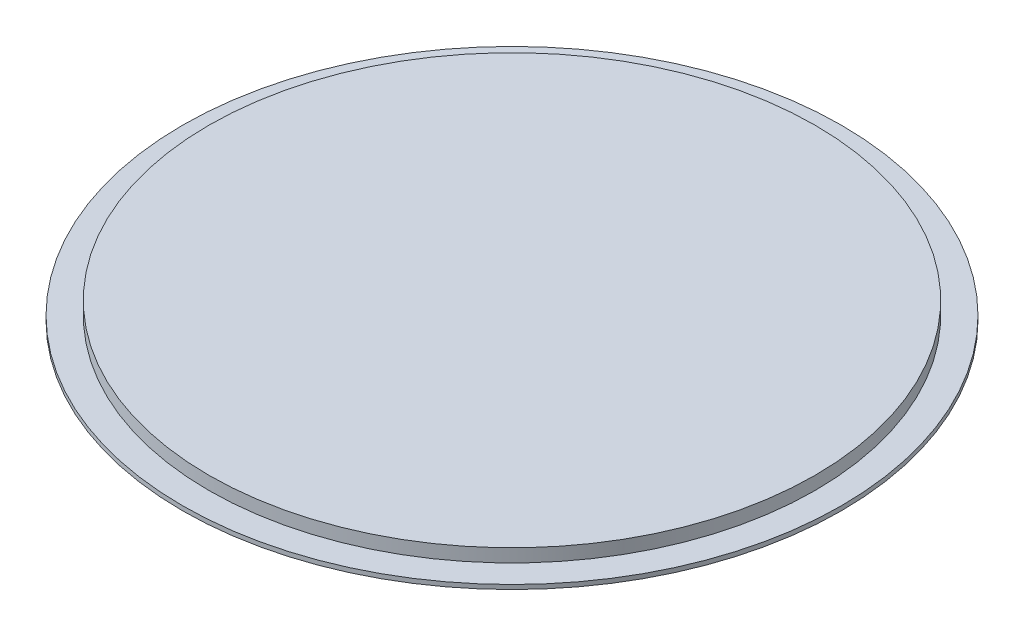
ISO-10303-21;
HEADER;
FILE_DESCRIPTION(('STEP AP214'),'2;1');
FILE_NAME('part.step','',(''),(''),'','','');
FILE_SCHEMA(('AUTOMOTIVE_DESIGN { 1 0 10303 214 1 1 1 1 }'));
ENDSEC;
DATA;
#1=APPLICATION_CONTEXT('core data for automotive mechanical design processes');
#2=APPLICATION_PROTOCOL_DEFINITION('international standard','automotive_design',2000,#1);
#3=PRODUCT_CONTEXT('',#1,'mechanical');
#4=PRODUCT('Part','Part','',(#3));
#5=PRODUCT_RELATED_PRODUCT_CATEGORY('part','',(#4));
#6=PRODUCT_DEFINITION_FORMATION('','',#4);
#7=PRODUCT_DEFINITION_CONTEXT('part definition',#1,'design');
#8=PRODUCT_DEFINITION('design','',#6,#7);
#9=PRODUCT_DEFINITION_SHAPE('','',#8);
#10=(LENGTH_UNIT() NAMED_UNIT(*) SI_UNIT(.MILLI.,.METRE.));
#11=(NAMED_UNIT(*) PLANE_ANGLE_UNIT() SI_UNIT($,.RADIAN.));
#12=(NAMED_UNIT(*) SI_UNIT($,.STERADIAN.) SOLID_ANGLE_UNIT());
#13=UNCERTAINTY_MEASURE_WITH_UNIT(LENGTH_MEASURE(1.E-05),#10,'distance_accuracy_value','');
#14=(GEOMETRIC_REPRESENTATION_CONTEXT(3) GLOBAL_UNCERTAINTY_ASSIGNED_CONTEXT((#13)) GLOBAL_UNIT_ASSIGNED_CONTEXT((#10,
#11,#12)) REPRESENTATION_CONTEXT('',''));
#15=CARTESIAN_POINT('',(0.,0.,0.));
#16=DIRECTION('',(0.,0.,1.));
#17=DIRECTION('',(1.,0.,0.));
#18=AXIS2_PLACEMENT_3D('',#15,#16,#17);
#19=CARTESIAN_POINT('',(0.,3.,0.));
#20=DIRECTION('',(0.,-1.,0.));
#21=DIRECTION('',(0.,0.,-1.));
#22=AXIS2_PLACEMENT_3D('',#19,#20,#21);
#23=CYLINDRICAL_SURFACE('',#22,34.5);
#24=CARTESIAN_POINT('',(0.,1.5,0.));
#25=DIRECTION('',(0.,1.,0.));
#26=DIRECTION('',(0.,0.,1.));
#27=AXIS2_PLACEMENT_3D('',#24,#25,#26);
#28=CIRCLE('',#27,34.5);
#29=CARTESIAN_POINT('',(0.,1.5,34.5));
#30=VERTEX_POINT('',#29);
#31=EDGE_CURVE('E41',#30,#30,#28,.T.);
#32=ORIENTED_EDGE('',*,*,#31,.T.);
#33=EDGE_LOOP('',(#32));
#34=FACE_BOUND('',#33,.T.);
#35=CARTESIAN_POINT('',(0.,3.,0.));
#36=DIRECTION('',(0.,1.,0.));
#37=DIRECTION('',(0.,0.,1.));
#38=AXIS2_PLACEMENT_3D('',#35,#36,#37);
#39=CIRCLE('',#38,34.5);
#40=CARTESIAN_POINT('',(0.,3.,34.5));
#41=VERTEX_POINT('',#40);
#42=EDGE_CURVE('E51',#41,#41,#39,.T.);
#43=ORIENTED_EDGE('',*,*,#42,.F.);
#44=EDGE_LOOP('',(#43));
#45=FACE_BOUND('',#44,.T.);
#46=ADVANCED_FACE('F37',(#34,#45),#23,.T.);
#47=CARTESIAN_POINT('',(0.,3.,0.));
#48=DIRECTION('',(0.,1.,0.));
#49=DIRECTION('',(0.,0.,1.));
#50=AXIS2_PLACEMENT_3D('',#47,#48,#49);
#51=PLANE('',#50);
#52=ORIENTED_EDGE('',*,*,#42,.T.);
#53=EDGE_LOOP('',(#52));
#54=FACE_BOUND('',#53,.T.);
#55=ADVANCED_FACE('F77',(#54),#51,.T.);
#56=CARTESIAN_POINT('',(0.,1.5,0.));
#57=DIRECTION('',(0.,-1.,0.));
#58=DIRECTION('',(0.,0.,-1.));
#59=AXIS2_PLACEMENT_3D('',#56,#57,#58);
#60=CYLINDRICAL_SURFACE('',#59,37.5);
#61=CARTESIAN_POINT('',(0.,1.5,0.));
#62=DIRECTION('',(0.,1.,0.));
#63=DIRECTION('',(0.,0.,1.));
#64=AXIS2_PLACEMENT_3D('',#61,#62,#63);
#65=CIRCLE('',#64,37.5);
#66=CARTESIAN_POINT('',(0.,1.5,37.5));
#67=VERTEX_POINT('',#66);
#68=EDGE_CURVE('E57',#67,#67,#65,.T.);
#69=ORIENTED_EDGE('',*,*,#68,.F.);
#70=EDGE_LOOP('',(#69));
#71=FACE_BOUND('',#70,.T.);
#72=CARTESIAN_POINT('',(0.,1.,0.));
#73=DIRECTION('',(0.,1.,0.));
#74=DIRECTION('',(0.,0.,1.));
#75=AXIS2_PLACEMENT_3D('',#72,#73,#74);
#76=CIRCLE('',#75,37.5);
#77=CARTESIAN_POINT('',(0.,1.,37.5));
#78=VERTEX_POINT('',#77);
#79=EDGE_CURVE('E46',#78,#78,#76,.T.);
#80=ORIENTED_EDGE('',*,*,#79,.T.);
#81=EDGE_LOOP('',(#80));
#82=FACE_BOUND('',#81,.T.);
#83=ADVANCED_FACE('F71',(#71,#82),#60,.T.);
#84=CARTESIAN_POINT('',(0.,1.5,0.));
#85=DIRECTION('',(0.,1.,0.));
#86=DIRECTION('',(0.,0.,1.));
#87=AXIS2_PLACEMENT_3D('',#84,#85,#86);
#88=PLANE('',#87);
#89=ORIENTED_EDGE('',*,*,#31,.F.);
#90=EDGE_LOOP('',(#89));
#91=FACE_BOUND('',#90,.T.);
#92=ORIENTED_EDGE('',*,*,#68,.T.);
#93=EDGE_LOOP('',(#92));
#94=FACE_BOUND('',#93,.T.);
#95=ADVANCED_FACE('F68',(#91,#94),#88,.T.);
#96=CARTESIAN_POINT('',(0.,0.,0.));
#97=DIRECTION('',(0.,1.,0.));
#98=DIRECTION('',(0.,0.,1.));
#99=AXIS2_PLACEMENT_3D('',#96,#97,#98);
#100=PLANE('',#99);
#101=CARTESIAN_POINT('',(0.,0.,0.));
#102=DIRECTION('',(0.,1.,0.));
#103=DIRECTION('',(0.,0.,1.));
#104=AXIS2_PLACEMENT_3D('',#101,#102,#103);
#105=CIRCLE('',#104,34.5);
#106=CARTESIAN_POINT('',(0.,0.,34.5));
#107=VERTEX_POINT('',#106);
#108=EDGE_CURVE('E10',#107,#107,#105,.F.);
#109=ORIENTED_EDGE('',*,*,#108,.T.);
#110=EDGE_LOOP('',(#109));
#111=FACE_BOUND('',#110,.T.);
#112=ADVANCED_FACE('F70',(#111),#100,.F.);
#113=CARTESIAN_POINT('',(0.,5.,0.));
#114=DIRECTION('',(0.,-1.,0.));
#115=DIRECTION('',(0.,0.,-1.));
#116=AXIS2_PLACEMENT_3D('',#113,#114,#115);
#117=TOROIDAL_SURFACE('',#116,34.5,5.);
#118=ORIENTED_EDGE('',*,*,#108,.F.);
#119=EDGE_LOOP('',(#118));
#120=FACE_BOUND('',#119,.T.);
#121=ORIENTED_EDGE('',*,*,#79,.F.);
#122=EDGE_LOOP('',(#121));
#123=FACE_BOUND('',#122,.T.);
#124=ADVANCED_FACE('F39',(#120,#123),#117,.T.);
#125=CLOSED_SHELL('',(#46,#55,#83,#95,#112,#124));
#126=MANIFOLD_SOLID_BREP('B2',#125);
#127=ADVANCED_BREP_SHAPE_REPRESENTATION('',(#18,#126),#14);
#128=SHAPE_DEFINITION_REPRESENTATION(#9,#127);
ENDSEC;
END-ISO-10303-21;
